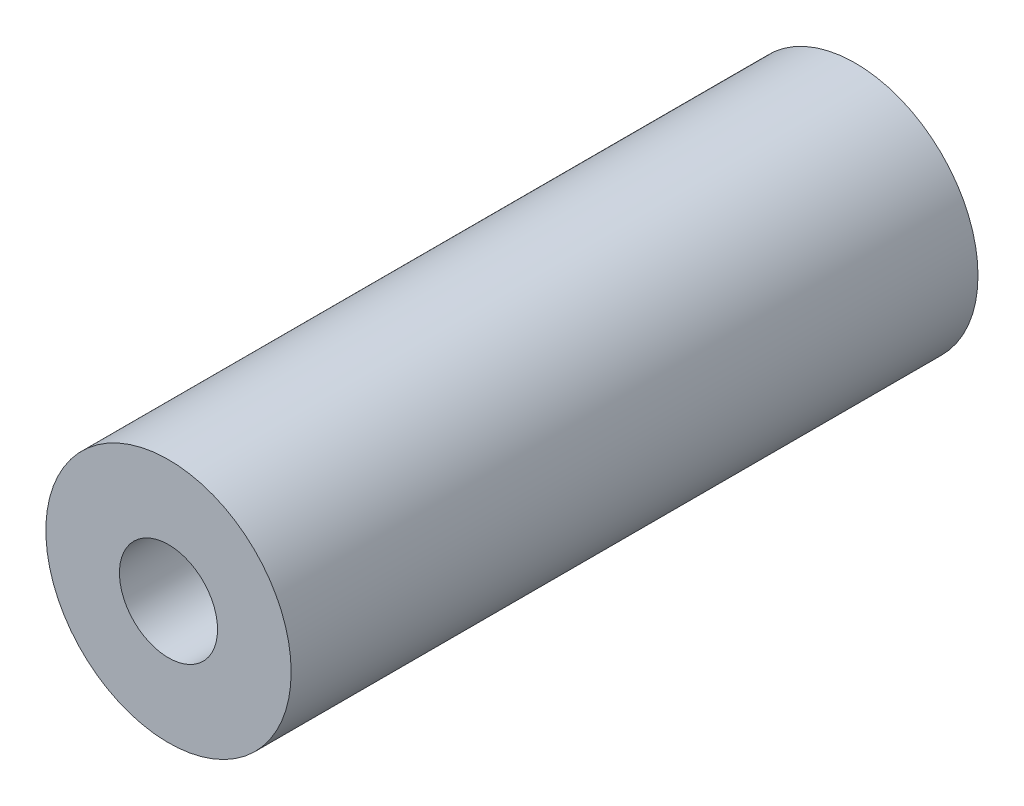
ISO-10303-21;
HEADER;
FILE_DESCRIPTION(('STEP AP214'),'2;1');
FILE_NAME('part.step','',(''),(''),'','','');
FILE_SCHEMA(('AUTOMOTIVE_DESIGN { 1 0 10303 214 1 1 1 1 }'));
ENDSEC;
DATA;
#1=APPLICATION_CONTEXT('core data for automotive mechanical design processes');
#2=APPLICATION_PROTOCOL_DEFINITION('international standard','automotive_design',2000,#1);
#3=PRODUCT_CONTEXT('',#1,'mechanical');
#4=PRODUCT('Part','Part','',(#3));
#5=PRODUCT_RELATED_PRODUCT_CATEGORY('part','',(#4));
#6=PRODUCT_DEFINITION_FORMATION('','',#4);
#7=PRODUCT_DEFINITION_CONTEXT('part definition',#1,'design');
#8=PRODUCT_DEFINITION('design','',#6,#7);
#9=PRODUCT_DEFINITION_SHAPE('','',#8);
#10=(LENGTH_UNIT() NAMED_UNIT(*) SI_UNIT(.MILLI.,.METRE.));
#11=(NAMED_UNIT(*) PLANE_ANGLE_UNIT() SI_UNIT($,.RADIAN.));
#12=(NAMED_UNIT(*) SI_UNIT($,.STERADIAN.) SOLID_ANGLE_UNIT());
#13=UNCERTAINTY_MEASURE_WITH_UNIT(LENGTH_MEASURE(1.E-05),#10,'distance_accuracy_value','');
#14=(GEOMETRIC_REPRESENTATION_CONTEXT(3) GLOBAL_UNCERTAINTY_ASSIGNED_CONTEXT((#13)) GLOBAL_UNIT_ASSIGNED_CONTEXT((#10,
#11,#12)) REPRESENTATION_CONTEXT('',''));
#15=CARTESIAN_POINT('',(0.,0.,0.));
#16=DIRECTION('',(0.,0.,1.));
#17=DIRECTION('',(1.,0.,0.));
#18=AXIS2_PLACEMENT_3D('',#15,#16,#17);
#19=CARTESIAN_POINT('',(24.,0.,14.));
#20=DIRECTION('',(0.,0.,1.));
#21=DIRECTION('',(1.,0.,0.));
#22=AXIS2_PLACEMENT_3D('',#19,#20,#21);
#23=PLANE('',#22);
#24=CARTESIAN_POINT('',(24.,0.,14.));
#25=DIRECTION('',(0.,0.,1.));
#26=DIRECTION('',(1.,0.,0.));
#27=AXIS2_PLACEMENT_3D('',#24,#25,#26);
#28=CIRCLE('',#27,2.5);
#29=CARTESIAN_POINT('',(26.5,0.,14.));
#30=VERTEX_POINT('',#29);
#31=EDGE_CURVE('E10',#30,#30,#28,.T.);
#32=ORIENTED_EDGE('',*,*,#31,.T.);
#33=EDGE_LOOP('',(#32));
#34=FACE_BOUND('',#33,.T.);
#35=CARTESIAN_POINT('',(24.,0.,14.));
#36=DIRECTION('',(0.,0.,1.));
#37=DIRECTION('',(1.,0.,0.));
#38=AXIS2_PLACEMENT_3D('',#35,#36,#37);
#39=CIRCLE('',#38,1.);
#40=CARTESIAN_POINT('',(25.,0.,14.));
#41=VERTEX_POINT('',#40);
#42=EDGE_CURVE('E45',#41,#41,#39,.T.);
#43=ORIENTED_EDGE('',*,*,#42,.F.);
#44=EDGE_LOOP('',(#43));
#45=FACE_BOUND('',#44,.T.);
#46=ADVANCED_FACE('F34',(#34,#45),#23,.T.);
#47=CARTESIAN_POINT('',(24.,0.,0.));
#48=DIRECTION('',(0.,0.,1.));
#49=DIRECTION('',(1.,0.,0.));
#50=AXIS2_PLACEMENT_3D('',#47,#48,#49);
#51=PLANE('',#50);
#52=CARTESIAN_POINT('',(24.,0.,0.));
#53=DIRECTION('',(0.,0.,1.));
#54=DIRECTION('',(1.,0.,0.));
#55=AXIS2_PLACEMENT_3D('',#52,#53,#54);
#56=CIRCLE('',#55,2.5);
#57=CARTESIAN_POINT('',(26.5,0.,0.));
#58=VERTEX_POINT('',#57);
#59=EDGE_CURVE('E38',#58,#58,#56,.T.);
#60=ORIENTED_EDGE('',*,*,#59,.F.);
#61=EDGE_LOOP('',(#60));
#62=FACE_BOUND('',#61,.T.);
#63=CARTESIAN_POINT('',(24.,0.,0.));
#64=DIRECTION('',(0.,0.,1.));
#65=DIRECTION('',(1.,0.,0.));
#66=AXIS2_PLACEMENT_3D('',#63,#64,#65);
#67=CIRCLE('',#66,1.);
#68=CARTESIAN_POINT('',(25.,0.,0.));
#69=VERTEX_POINT('',#68);
#70=EDGE_CURVE('E47',#69,#69,#67,.T.);
#71=ORIENTED_EDGE('',*,*,#70,.T.);
#72=EDGE_LOOP('',(#71));
#73=FACE_BOUND('',#72,.T.);
#74=ADVANCED_FACE('F57',(#62,#73),#51,.F.);
#75=CARTESIAN_POINT('',(24.,0.,14.));
#76=DIRECTION('',(0.,0.,-1.));
#77=DIRECTION('',(-1.,0.,0.));
#78=AXIS2_PLACEMENT_3D('',#75,#76,#77);
#79=CYLINDRICAL_SURFACE('',#78,2.5);
#80=ORIENTED_EDGE('',*,*,#31,.F.);
#81=EDGE_LOOP('',(#80));
#82=FACE_BOUND('',#81,.T.);
#83=ORIENTED_EDGE('',*,*,#59,.T.);
#84=EDGE_LOOP('',(#83));
#85=FACE_BOUND('',#84,.T.);
#86=ADVANCED_FACE('F36',(#82,#85),#79,.T.);
#87=CARTESIAN_POINT('',(24.,0.,14.));
#88=DIRECTION('',(0.,0.,-1.));
#89=DIRECTION('',(-1.,0.,0.));
#90=AXIS2_PLACEMENT_3D('',#87,#88,#89);
#91=CYLINDRICAL_SURFACE('',#90,1.);
#92=ORIENTED_EDGE('',*,*,#42,.T.);
#93=EDGE_LOOP('',(#92));
#94=FACE_BOUND('',#93,.T.);
#95=ORIENTED_EDGE('',*,*,#70,.F.);
#96=EDGE_LOOP('',(#95));
#97=FACE_BOUND('',#96,.T.);
#98=ADVANCED_FACE('F53',(#94,#97),#91,.F.);
#99=CLOSED_SHELL('',(#46,#74,#86,#98));
#100=MANIFOLD_SOLID_BREP('B2',#99);
#101=ADVANCED_BREP_SHAPE_REPRESENTATION('',(#18,#100),#14);
#102=SHAPE_DEFINITION_REPRESENTATION(#9,#101);
ENDSEC;
END-ISO-10303-21;
